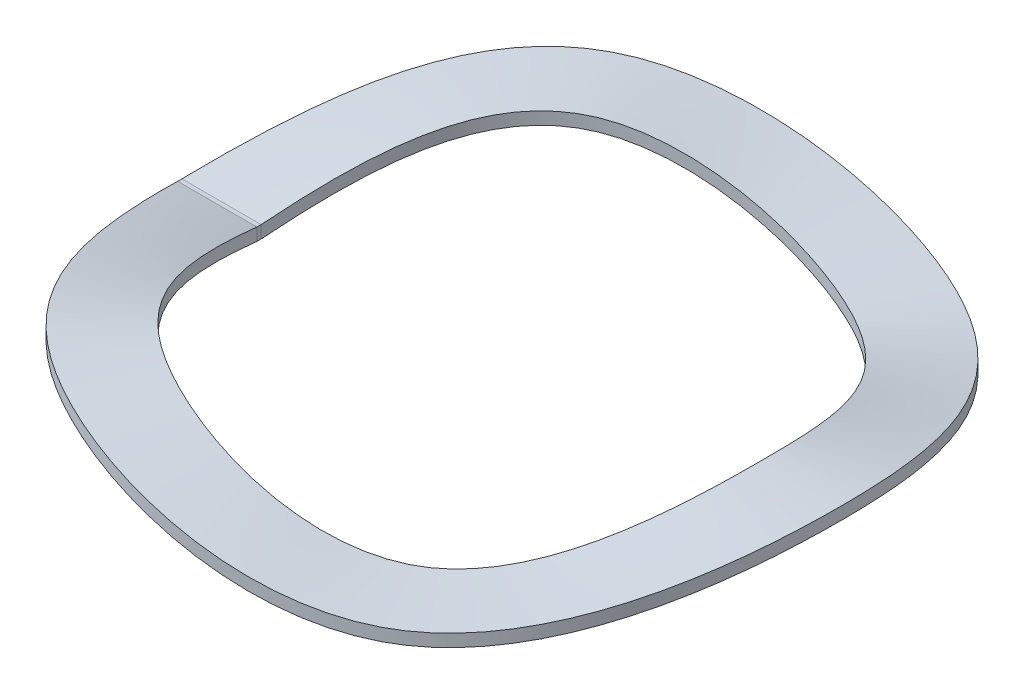
ISO-10303-21;
HEADER;
FILE_DESCRIPTION(('STEP AP214'),'2;1');
FILE_NAME('part.step','',(''),(''),'','','');
FILE_SCHEMA(('AUTOMOTIVE_DESIGN { 1 0 10303 214 1 1 1 1 }'));
ENDSEC;
DATA;
#1=APPLICATION_CONTEXT('core data for automotive mechanical design processes');
#2=APPLICATION_PROTOCOL_DEFINITION('international standard','automotive_design',2000,#1);
#3=PRODUCT_CONTEXT('',#1,'mechanical');
#4=PRODUCT('Part','Part','',(#3));
#5=PRODUCT_RELATED_PRODUCT_CATEGORY('part','',(#4));
#6=PRODUCT_DEFINITION_FORMATION('','',#4);
#7=PRODUCT_DEFINITION_CONTEXT('part definition',#1,'design');
#8=PRODUCT_DEFINITION('design','',#6,#7);
#9=PRODUCT_DEFINITION_SHAPE('','',#8);
#10=(LENGTH_UNIT() NAMED_UNIT(*) SI_UNIT(.MILLI.,.METRE.));
#11=(NAMED_UNIT(*) PLANE_ANGLE_UNIT() SI_UNIT($,.RADIAN.));
#12=(NAMED_UNIT(*) SI_UNIT($,.STERADIAN.) SOLID_ANGLE_UNIT());
#13=UNCERTAINTY_MEASURE_WITH_UNIT(LENGTH_MEASURE(1.E-05),#10,'distance_accuracy_value','');
#14=(GEOMETRIC_REPRESENTATION_CONTEXT(3) GLOBAL_UNCERTAINTY_ASSIGNED_CONTEXT((#13)) GLOBAL_UNIT_ASSIGNED_CONTEXT((#10,
#11,#12)) REPRESENTATION_CONTEXT('',''));
#15=CARTESIAN_POINT('',(0.,0.,0.));
#16=DIRECTION('',(0.,0.,1.));
#17=DIRECTION('',(1.,0.,0.));
#18=AXIS2_PLACEMENT_3D('',#15,#16,#17);
#19=CARTESIAN_POINT('',(-6.,-0.400000000000001,0.));
#20=CARTESIAN_POINT('',(-5.5,0.333333333333333,-2.59807621135331));
#21=CARTESIAN_POINT('',(-3.8333179589676,1.4578130603273,-5.99560515447315));
#22=CARTESIAN_POINT('',(3.66661285638655,-1.40234571114554,-6.29518217855377));
#23=CARTESIAN_POINT('',(7.16686653342131,1.75156978425488,-0.000580667551631552));
#24=CARTESIAN_POINT('',(3.66592100992823,-1.40393342587398,6.29750484876022));
#25=CARTESIAN_POINT('',(-3.80026481582859,1.45257680133357,5.98872832657293));
#26=CARTESIAN_POINT('',(-5.48556759258809,0.333333333333333,2.65624840557529));
#27=CARTESIAN_POINT('',(-6.,-0.400000000000001,0.1));
#28=CARTESIAN_POINT('',(-6.,-0.500000000000001,0.));
#29=CARTESIAN_POINT('',(-5.5,0.233333333333333,-2.59807621135331));
#30=CARTESIAN_POINT('',(-3.8333179589676,1.3578130603273,-5.99560515447315));
#31=CARTESIAN_POINT('',(3.66661285638655,-1.50234571114554,-6.29518217855377));
#32=CARTESIAN_POINT('',(7.16686653342131,1.65156978425488,-0.000580667551631552));
#33=CARTESIAN_POINT('',(3.66592100992823,-1.50393342587398,6.29750484876022));
#34=CARTESIAN_POINT('',(-3.80026481582859,1.35257680133357,5.98872832657293));
#35=CARTESIAN_POINT('',(-5.48556759258809,0.233333333333333,2.65624840557529));
#36=CARTESIAN_POINT('',(-6.,-0.500000000000001,0.1));
#37=CARTESIAN_POINT('',(-6.,-0.600000000000001,0.));
#38=CARTESIAN_POINT('',(-5.5,0.133333333333333,-2.59807621135331));
#39=CARTESIAN_POINT('',(-3.8333179589676,1.2578130603273,-5.99560515447315));
#40=CARTESIAN_POINT('',(3.66661285638655,-1.60234571114554,-6.29518217855377));
#41=CARTESIAN_POINT('',(7.16686653342131,1.55156978425488,-0.000580667551631552));
#42=CARTESIAN_POINT('',(3.66592100992823,-1.60393342587398,6.29750484876022));
#43=CARTESIAN_POINT('',(-3.80026481582859,1.25257680133357,5.98872832657293));
#44=CARTESIAN_POINT('',(-5.48556759258809,0.133333333333333,2.65624840557529));
#45=CARTESIAN_POINT('',(-6.,-0.600000000000001,0.1));
#46=CARTESIAN_POINT('',(-6.,-0.700000000000001,0.));
#47=CARTESIAN_POINT('',(-5.5,0.0333333333333327,-2.59807621135331));
#48=CARTESIAN_POINT('',(-3.8333179589676,1.1578130603273,-5.99560515447315));
#49=CARTESIAN_POINT('',(3.66661285638655,-1.70234571114554,-6.29518217855377));
#50=CARTESIAN_POINT('',(7.16686653342131,1.45156978425488,-0.000580667551631552));
#51=CARTESIAN_POINT('',(3.66592100992823,-1.70393342587398,6.29750484876022));
#52=CARTESIAN_POINT('',(-3.80026481582859,1.15257680133357,5.98872832657293));
#53=CARTESIAN_POINT('',(-5.48556759258809,0.0333333333333328,2.65624840557529));
#54=CARTESIAN_POINT('',(-6.,-0.700000000000001,0.1));
#55=B_SPLINE_SURFACE_WITH_KNOTS('',3,3,((#19,#20,#21,#22,#23,#24,#25,#26,#27),(#28,#29,#30,#31,
#32,#33,#34,#35,#36),(#37,#38,#39,#40,#41,#42,#43,#44,#45),(#46,#47,#48,#49,#50,#51,#52,#53,
#54)),.UNSPECIFIED.,.F.,.F.,.F.,(4,4),(4,1,1,1,1,1,4),(0.,1.),(0.,0.167004014911679,
0.334008029823358,0.501012044735039,0.668016059646718,0.835020074558397,1.),.UNSPECIFIED.);
#56=DIRECTION('',(0.,1.,0.));
#57=VECTOR('',#56,1.);
#58=CARTESIAN_POINT('',(-6.,-0.400000000000001,0.));
#59=LINE('',#58,#57);
#60=CARTESIAN_POINT('',(-6.,-0.700000000000001,0.));
#61=VERTEX_POINT('',#60);
#62=CARTESIAN_POINT('',(-6.,-0.400000000000001,0.));
#63=VERTEX_POINT('',#62);
#64=EDGE_CURVE('E129',#61,#63,#59,.T.);
#65=CARTESIAN_POINT('',(-6.,-0.700000000000001,0.));
#66=CARTESIAN_POINT('',(-5.5,0.0333333333333327,-2.59807621135331));
#67=CARTESIAN_POINT('',(-3.8333179589676,1.1578130603273,-5.99560515447315));
#68=CARTESIAN_POINT('',(3.66661285638655,-1.70234571114554,-6.29518217855377));
#69=CARTESIAN_POINT('',(7.16686653342131,1.45156978425488,-0.000580667551631552));
#70=CARTESIAN_POINT('',(3.66592100992823,-1.70393342587398,6.29750484876022));
#71=CARTESIAN_POINT('',(-3.80026481582859,1.15257680133357,5.98872832657293));
#72=CARTESIAN_POINT('',(-5.48556759258809,0.0333333333333328,2.65624840557529));
#73=CARTESIAN_POINT('',(-6.,-0.700000000000001,0.1));
#74=B_SPLINE_CURVE_WITH_KNOTS('',3,(#65,#66,#67,#68,#69,#70,#71,#72,#73),.UNSPECIFIED.,.F.,.F.,
(4,1,1,1,1,1,4),(0.,0.167004014911679,0.334008029823358,0.501012044735039,0.668016059646718,
0.835020074558397,1.),.UNSPECIFIED.);
#75=CARTESIAN_POINT('',(-6.,-0.700000000000001,0.1));
#76=VERTEX_POINT('',#75);
#77=EDGE_CURVE('E131',#61,#76,#74,.T.);
#78=DIRECTION('',(0.,1.,0.));
#79=VECTOR('',#78,1.);
#80=CARTESIAN_POINT('',(-6.,-0.400000000000001,0.1));
#81=LINE('',#80,#79);
#82=CARTESIAN_POINT('',(-6.,-0.400000000000001,0.1));
#83=VERTEX_POINT('',#82);
#84=EDGE_CURVE('E149',#76,#83,#81,.T.);
#85=CARTESIAN_POINT('',(-6.,-0.400000000000001,0.));
#86=CARTESIAN_POINT('',(-5.5,0.333333333333333,-2.59807621135331));
#87=CARTESIAN_POINT('',(-3.8333179589676,1.4578130603273,-5.99560515447315));
#88=CARTESIAN_POINT('',(3.66661285638655,-1.40234571114554,-6.29518217855377));
#89=CARTESIAN_POINT('',(7.16686653342131,1.75156978425488,-0.000580667551631552));
#90=CARTESIAN_POINT('',(3.66592100992823,-1.40393342587398,6.29750484876022));
#91=CARTESIAN_POINT('',(-3.80026481582859,1.45257680133357,5.98872832657293));
#92=CARTESIAN_POINT('',(-5.48556759258809,0.333333333333333,2.65624840557529));
#93=CARTESIAN_POINT('',(-6.,-0.400000000000001,0.1));
#94=B_SPLINE_CURVE_WITH_KNOTS('',3,(#85,#86,#87,#88,#89,#90,#91,#92,#93),.UNSPECIFIED.,.F.,.F.,
(4,1,1,1,1,1,4),(0.,0.167004014911679,0.334008029823358,0.501012044735039,0.668016059646718,
0.835020074558397,1.),.UNSPECIFIED.);
#95=EDGE_CURVE('E128',#83,#63,#94,.F.);
#96=ORIENTED_EDGE('',*,*,#64,.F.);
#97=ORIENTED_EDGE('',*,*,#77,.T.);
#98=ORIENTED_EDGE('',*,*,#84,.T.);
#99=ORIENTED_EDGE('',*,*,#95,.T.);
#100=EDGE_LOOP('',(#96,#97,#98,#99));
#101=FACE_BOUND('',#100,.T.);
#102=ADVANCED_FACE('F53',(#101),#55,.T.);
#103=CARTESIAN_POINT('',(-6.,-0.700000000000001,0.));
#104=CARTESIAN_POINT('',(-5.5,0.0333333333333326,-2.59807621135331));
#105=CARTESIAN_POINT('',(-3.8333179589676,1.1578130603273,-5.99560515447315));
#106=CARTESIAN_POINT('',(3.66661285638655,-1.70234571114554,-6.29518217855377));
#107=CARTESIAN_POINT('',(7.16686653342131,1.45156978425488,-0.000580667551631901));
#108=CARTESIAN_POINT('',(3.66592100992823,-1.70393342587398,6.29750484876022));
#109=CARTESIAN_POINT('',(-3.80026481582859,1.15257680133357,5.98872832657293));
#110=CARTESIAN_POINT('',(-5.48556759258809,0.0333333333333328,2.65624840557529));
#111=CARTESIAN_POINT('',(-6.,-0.700000000000001,0.1));
#112=CARTESIAN_POINT('',(-6.63333333333333,-0.700000000000001,0.));
#113=CARTESIAN_POINT('',(-6.08055555555556,0.0333333333333324,-2.87231758921838));
#114=CARTESIAN_POINT('',(-4.23794198974714,1.1578130603273,-6.62845859335296));
#115=CARTESIAN_POINT('',(4.05363029744827,-1.70234571114554,-6.95972961005769));
#116=CARTESIAN_POINT('',(7.92342079995396,1.45156978425488,-0.000434037037001991));
#117=CARTESIAN_POINT('',(4.0526865027359,-1.70393342587398,6.96146575820562));
#118=CARTESIAN_POINT('',(-4.20068791012364,1.15257680133357,6.6237519734637));
#119=CARTESIAN_POINT('',(-6.06612295721908,0.0333333333333327,2.93050274793111));
#120=CARTESIAN_POINT('',(-6.63333333333333,-0.700000000000001,0.1));
#121=CARTESIAN_POINT('',(-7.26666666666667,-0.700000000000002,0.));
#122=CARTESIAN_POINT('',(-6.66111111111111,0.0333333333333324,-3.14655896708345));
#123=CARTESIAN_POINT('',(-4.64256602052668,1.1578130603273,-7.26131203223277));
#124=CARTESIAN_POINT('',(4.44064773850999,-1.70234571114554,-7.62427704156161));
#125=CARTESIAN_POINT('',(8.67997506648661,1.45156978425488,-0.00028740652237243));
#126=CARTESIAN_POINT('',(4.43945199554358,-1.70393342587398,7.62542666765102));
#127=CARTESIAN_POINT('',(-4.60111100441868,1.15257680133357,7.25877562035446));
#128=CARTESIAN_POINT('',(-6.64667832185008,0.0333333333333326,3.20475709028693));
#129=CARTESIAN_POINT('',(-7.26666666666667,-0.700000000000002,0.1));
#130=CARTESIAN_POINT('',(-7.9,-0.700000000000002,0.));
#131=CARTESIAN_POINT('',(-7.24166666666667,0.0333333333333322,-3.42080034494852));
#132=CARTESIAN_POINT('',(-5.04719005130622,1.1578130603273,-7.89416547111258));
#133=CARTESIAN_POINT('',(4.82766517957171,-1.70234571114554,-8.28882447306554));
#134=CARTESIAN_POINT('',(9.43652933301926,1.45156978425488,-0.000140776007741125));
#135=CARTESIAN_POINT('',(4.82621748835126,-1.70393342587398,8.28938757709641));
#136=CARTESIAN_POINT('',(-5.00153409871373,1.15257680133357,7.89379926724523));
#137=CARTESIAN_POINT('',(-7.22723368648107,0.0333333333333323,3.47901143264275));
#138=CARTESIAN_POINT('',(-7.9,-0.700000000000002,0.1));
#139=B_SPLINE_SURFACE_WITH_KNOTS('',3,3,((#103,#104,#105,#106,#107,#108,#109,#110,#111),(#112,
#113,#114,#115,#116,#117,#118,#119,#120),(#121,#122,#123,#124,#125,#126,#127,#128,#129),(#130,
#131,#132,#133,#134,#135,#136,#137,#138)),.UNSPECIFIED.,.F.,.F.,.F.,(4,4),(4,1,1,1,1,1,4),(0.,
1.),(0.,0.167004014911679,0.334008029823358,0.501012044735039,0.668016059646718,
0.835020074558397,1.),.UNSPECIFIED.);
#140=DIRECTION('',(1.,0.,0.));
#141=VECTOR('',#140,1.);
#142=CARTESIAN_POINT('',(-7.9,-0.700000000000002,0.));
#143=LINE('',#142,#141);
#144=CARTESIAN_POINT('',(-7.9,-0.700000000000002,0.));
#145=VERTEX_POINT('',#144);
#146=EDGE_CURVE('E81',#145,#61,#143,.T.);
#147=CARTESIAN_POINT('',(-7.9,-0.700000000000002,0.));
#148=CARTESIAN_POINT('',(-7.24166666666667,0.0333333333333322,-3.42080034494852));
#149=CARTESIAN_POINT('',(-5.04719005130622,1.1578130603273,-7.89416547111258));
#150=CARTESIAN_POINT('',(4.82766517957171,-1.70234571114554,-8.28882447306554));
#151=CARTESIAN_POINT('',(9.43652933301926,1.45156978425488,-0.000140776007741125));
#152=CARTESIAN_POINT('',(4.82621748835126,-1.70393342587398,8.28938757709641));
#153=CARTESIAN_POINT('',(-5.00153409871373,1.15257680133357,7.89379926724523));
#154=CARTESIAN_POINT('',(-7.22723368648107,0.0333333333333323,3.47901143264275));
#155=CARTESIAN_POINT('',(-7.9,-0.700000000000002,0.1));
#156=B_SPLINE_CURVE_WITH_KNOTS('',3,(#147,#148,#149,#150,#151,#152,#153,#154,#155),
.UNSPECIFIED.,.F.,.F.,(4,1,1,1,1,1,4),(0.,0.167004014911679,0.334008029823358,0.501012044735039,
0.668016059646718,0.835020074558397,1.),.UNSPECIFIED.);
#157=CARTESIAN_POINT('',(-7.9,-0.700000000000002,0.1));
#158=VERTEX_POINT('',#157);
#159=EDGE_CURVE('E114',#145,#158,#156,.T.);
#160=DIRECTION('',(1.,0.,0.));
#161=VECTOR('',#160,1.);
#162=CARTESIAN_POINT('',(-7.9,-0.700000000000002,0.1));
#163=LINE('',#162,#161);
#164=EDGE_CURVE('E65',#158,#76,#163,.T.);
#165=ORIENTED_EDGE('',*,*,#146,.F.);
#166=ORIENTED_EDGE('',*,*,#159,.T.);
#167=ORIENTED_EDGE('',*,*,#164,.T.);
#168=ORIENTED_EDGE('',*,*,#77,.F.);
#169=EDGE_LOOP('',(#165,#166,#167,#168));
#170=FACE_BOUND('',#169,.T.);
#171=ADVANCED_FACE('F253',(#170),#139,.T.);
#172=CARTESIAN_POINT('',(-7.9,-0.400000000000001,0.));
#173=CARTESIAN_POINT('',(-7.24166666666667,0.333333333333333,-3.42080034494852));
#174=CARTESIAN_POINT('',(-5.04719005130622,1.4578130603273,-7.89416547111258));
#175=CARTESIAN_POINT('',(4.82766517957171,-1.40234571114554,-8.28882447306554));
#176=CARTESIAN_POINT('',(9.43652933301926,1.75156978425488,-0.000140776007741125));
#177=CARTESIAN_POINT('',(4.82621748835126,-1.40393342587398,8.28938757709641));
#178=CARTESIAN_POINT('',(-5.00153409871373,1.45257680133357,7.89379926724523));
#179=CARTESIAN_POINT('',(-7.22723368648107,0.333333333333332,3.47901143264275));
#180=CARTESIAN_POINT('',(-7.9,-0.400000000000001,0.1));
#181=CARTESIAN_POINT('',(-7.26666666666667,-0.400000000000001,0.));
#182=CARTESIAN_POINT('',(-6.66111111111111,0.333333333333333,-3.14655896708345));
#183=CARTESIAN_POINT('',(-4.64256602052668,1.4578130603273,-7.26131203223277));
#184=CARTESIAN_POINT('',(4.44064773850999,-1.40234571114554,-7.62427704156161));
#185=CARTESIAN_POINT('',(8.67997506648661,1.75156978425488,-0.00028740652237243));
#186=CARTESIAN_POINT('',(4.43945199554358,-1.40393342587398,7.62542666765102));
#187=CARTESIAN_POINT('',(-4.60111100441868,1.45257680133357,7.25877562035446));
#188=CARTESIAN_POINT('',(-6.64667832185008,0.333333333333333,3.20475709028693));
#189=CARTESIAN_POINT('',(-7.26666666666667,-0.400000000000001,0.1));
#190=CARTESIAN_POINT('',(-6.63333333333333,-0.400000000000001,0.));
#191=CARTESIAN_POINT('',(-6.08055555555556,0.333333333333333,-2.87231758921838));
#192=CARTESIAN_POINT('',(-4.23794198974714,1.4578130603273,-6.62845859335296));
#193=CARTESIAN_POINT('',(4.05363029744827,-1.40234571114554,-6.95972961005769));
#194=CARTESIAN_POINT('',(7.92342079995396,1.75156978425488,-0.000434037037001991));
#195=CARTESIAN_POINT('',(4.0526865027359,-1.40393342587398,6.96146575820562));
#196=CARTESIAN_POINT('',(-4.20068791012364,1.45257680133357,6.6237519734637));
#197=CARTESIAN_POINT('',(-6.06612295721908,0.333333333333333,2.93050274793111));
#198=CARTESIAN_POINT('',(-6.63333333333333,-0.400000000000001,0.1));
#199=CARTESIAN_POINT('',(-6.,-0.400000000000001,0.));
#200=CARTESIAN_POINT('',(-5.5,0.333333333333333,-2.59807621135331));
#201=CARTESIAN_POINT('',(-3.8333179589676,1.4578130603273,-5.99560515447315));
#202=CARTESIAN_POINT('',(3.66661285638655,-1.40234571114554,-6.29518217855377));
#203=CARTESIAN_POINT('',(7.16686653342131,1.75156978425488,-0.000580667551631901));
#204=CARTESIAN_POINT('',(3.66592100992823,-1.40393342587398,6.29750484876022));
#205=CARTESIAN_POINT('',(-3.80026481582859,1.45257680133357,5.98872832657293));
#206=CARTESIAN_POINT('',(-5.48556759258809,0.333333333333333,2.65624840557529));
#207=CARTESIAN_POINT('',(-6.,-0.400000000000001,0.1));
#208=B_SPLINE_SURFACE_WITH_KNOTS('',3,3,((#172,#173,#174,#175,#176,#177,#178,#179,#180),(#181,
#182,#183,#184,#185,#186,#187,#188,#189),(#190,#191,#192,#193,#194,#195,#196,#197,#198),(#199,
#200,#201,#202,#203,#204,#205,#206,#207)),.UNSPECIFIED.,.F.,.F.,.F.,(4,4),(4,1,1,1,1,1,4),(0.,
1.),(0.,0.167004014911679,0.334008029823358,0.501012044735039,0.668016059646718,
0.835020074558397,1.),.UNSPECIFIED.);
#209=DIRECTION('',(-1.,0.,0.));
#210=VECTOR('',#209,1.);
#211=CARTESIAN_POINT('',(-7.9,-0.400000000000001,0.));
#212=LINE('',#211,#210);
#213=CARTESIAN_POINT('',(-7.9,-0.400000000000001,0.));
#214=VERTEX_POINT('',#213);
#215=EDGE_CURVE('E109',#63,#214,#212,.T.);
#216=DIRECTION('',(-1.,0.,0.));
#217=VECTOR('',#216,1.);
#218=CARTESIAN_POINT('',(-7.9,-0.400000000000001,0.1));
#219=LINE('',#218,#217);
#220=CARTESIAN_POINT('',(-7.9,-0.400000000000001,0.1));
#221=VERTEX_POINT('',#220);
#222=EDGE_CURVE('E111',#83,#221,#219,.T.);
#223=CARTESIAN_POINT('',(-7.9,-0.400000000000001,0.));
#224=CARTESIAN_POINT('',(-7.24166666666667,0.333333333333333,-3.42080034494852));
#225=CARTESIAN_POINT('',(-5.04719005130622,1.4578130603273,-7.89416547111258));
#226=CARTESIAN_POINT('',(4.82766517957171,-1.40234571114554,-8.28882447306554));
#227=CARTESIAN_POINT('',(9.43652933301926,1.75156978425488,-0.000140776007741125));
#228=CARTESIAN_POINT('',(4.82621748835126,-1.40393342587398,8.28938757709641));
#229=CARTESIAN_POINT('',(-5.00153409871373,1.45257680133357,7.89379926724523));
#230=CARTESIAN_POINT('',(-7.22723368648107,0.333333333333332,3.47901143264275));
#231=CARTESIAN_POINT('',(-7.9,-0.400000000000001,0.1));
#232=B_SPLINE_CURVE_WITH_KNOTS('',3,(#223,#224,#225,#226,#227,#228,#229,#230,#231),
.UNSPECIFIED.,.F.,.F.,(4,1,1,1,1,1,4),(0.,0.167004014911679,0.334008029823358,0.501012044735039,
0.668016059646718,0.835020074558397,1.),.UNSPECIFIED.);
#233=EDGE_CURVE('E104',#214,#221,#232,.T.);
#234=ORIENTED_EDGE('',*,*,#215,.F.);
#235=ORIENTED_EDGE('',*,*,#95,.F.);
#236=ORIENTED_EDGE('',*,*,#222,.T.);
#237=ORIENTED_EDGE('',*,*,#233,.F.);
#238=EDGE_LOOP('',(#234,#235,#236,#237));
#239=FACE_BOUND('',#238,.T.);
#240=ADVANCED_FACE('F106',(#239),#208,.T.);
#241=CARTESIAN_POINT('',(-7.9,-0.700000000000002,0.));
#242=CARTESIAN_POINT('',(-7.24166666666667,0.0333333333333322,-3.42080034494852));
#243=CARTESIAN_POINT('',(-5.04719005130622,1.1578130603273,-7.89416547111258));
#244=CARTESIAN_POINT('',(4.82766517957171,-1.70234571114554,-8.28882447306554));
#245=CARTESIAN_POINT('',(9.43652933301926,1.45156978425488,-0.000140776007741125));
#246=CARTESIAN_POINT('',(4.82621748835126,-1.70393342587398,8.28938757709641));
#247=CARTESIAN_POINT('',(-5.00153409871373,1.15257680133357,7.89379926724523));
#248=CARTESIAN_POINT('',(-7.22723368648107,0.0333333333333323,3.47901143264275));
#249=CARTESIAN_POINT('',(-7.9,-0.700000000000002,0.1));
#250=CARTESIAN_POINT('',(-7.9,-0.600000000000002,0.));
#251=CARTESIAN_POINT('',(-7.24166666666667,0.133333333333332,-3.42080034494852));
#252=CARTESIAN_POINT('',(-5.04719005130622,1.2578130603273,-7.89416547111258));
#253=CARTESIAN_POINT('',(4.82766517957171,-1.60234571114554,-8.28882447306554));
#254=CARTESIAN_POINT('',(9.43652933301926,1.55156978425488,-0.000140776007741125));
#255=CARTESIAN_POINT('',(4.82621748835126,-1.60393342587398,8.28938757709641));
#256=CARTESIAN_POINT('',(-5.00153409871373,1.25257680133357,7.89379926724523));
#257=CARTESIAN_POINT('',(-7.22723368648107,0.133333333333332,3.47901143264275));
#258=CARTESIAN_POINT('',(-7.9,-0.600000000000002,0.1));
#259=CARTESIAN_POINT('',(-7.9,-0.500000000000001,0.));
#260=CARTESIAN_POINT('',(-7.24166666666667,0.233333333333333,-3.42080034494852));
#261=CARTESIAN_POINT('',(-5.04719005130622,1.3578130603273,-7.89416547111258));
#262=CARTESIAN_POINT('',(4.82766517957171,-1.50234571114554,-8.28882447306554));
#263=CARTESIAN_POINT('',(9.43652933301926,1.65156978425488,-0.000140776007741125));
#264=CARTESIAN_POINT('',(4.82621748835126,-1.50393342587398,8.28938757709641));
#265=CARTESIAN_POINT('',(-5.00153409871373,1.35257680133357,7.89379926724523));
#266=CARTESIAN_POINT('',(-7.22723368648107,0.233333333333333,3.47901143264275));
#267=CARTESIAN_POINT('',(-7.9,-0.500000000000001,0.1));
#268=CARTESIAN_POINT('',(-7.9,-0.400000000000001,0.));
#269=CARTESIAN_POINT('',(-7.24166666666667,0.333333333333333,-3.42080034494852));
#270=CARTESIAN_POINT('',(-5.04719005130622,1.4578130603273,-7.89416547111258));
#271=CARTESIAN_POINT('',(4.82766517957171,-1.40234571114554,-8.28882447306554));
#272=CARTESIAN_POINT('',(9.43652933301926,1.75156978425488,-0.000140776007741125));
#273=CARTESIAN_POINT('',(4.82621748835126,-1.40393342587398,8.28938757709641));
#274=CARTESIAN_POINT('',(-5.00153409871373,1.45257680133357,7.89379926724523));
#275=CARTESIAN_POINT('',(-7.22723368648107,0.333333333333332,3.47901143264275));
#276=CARTESIAN_POINT('',(-7.9,-0.400000000000001,0.1));
#277=B_SPLINE_SURFACE_WITH_KNOTS('',3,3,((#241,#242,#243,#244,#245,#246,#247,#248,#249),(#250,
#251,#252,#253,#254,#255,#256,#257,#258),(#259,#260,#261,#262,#263,#264,#265,#266,#267),(#268,
#269,#270,#271,#272,#273,#274,#275,#276)),.UNSPECIFIED.,.F.,.F.,.F.,(4,4),(4,1,1,1,1,1,4),(0.,
1.),(0.,0.167004014911679,0.334008029823358,0.501012044735039,0.668016059646718,
0.835020074558397,1.),.UNSPECIFIED.);
#278=DIRECTION('',(0.,-1.,0.));
#279=VECTOR('',#278,1.);
#280=CARTESIAN_POINT('',(-7.9,-0.400000000000001,0.));
#281=LINE('',#280,#279);
#282=EDGE_CURVE('E116',#214,#145,#281,.T.);
#283=DIRECTION('',(0.,-1.,0.));
#284=VECTOR('',#283,1.);
#285=CARTESIAN_POINT('',(-7.9,-0.400000000000001,0.1));
#286=LINE('',#285,#284);
#287=EDGE_CURVE('E12',#221,#158,#286,.T.);
#288=ORIENTED_EDGE('',*,*,#282,.F.);
#289=ORIENTED_EDGE('',*,*,#233,.T.);
#290=ORIENTED_EDGE('',*,*,#287,.T.);
#291=ORIENTED_EDGE('',*,*,#159,.F.);
#292=EDGE_LOOP('',(#288,#289,#290,#291));
#293=FACE_BOUND('',#292,.T.);
#294=ADVANCED_FACE('F55',(#293),#277,.T.);
#295=CARTESIAN_POINT('',(0.,-0.7,0.));
#296=DIRECTION('',(0.,1.,0.));
#297=DIRECTION('',(-1.,0.,0.));
#298=AXIS2_PLACEMENT_3D('',#295,#296,#297);
#299=PLANE('',#298);
#300=DIRECTION('',(0.,0.,1.));
#301=VECTOR('',#300,1.);
#302=CARTESIAN_POINT('',(-6.,-0.700000000000001,0.));
#303=LINE('',#302,#301);
#304=EDGE_CURVE('E144',#61,#76,#303,.T.);
#305=ORIENTED_EDGE('',*,*,#304,.T.);
#306=ORIENTED_EDGE('',*,*,#164,.F.);
#307=DIRECTION('',(0.,0.,1.));
#308=VECTOR('',#307,1.);
#309=CARTESIAN_POINT('',(-7.9,-0.700000000000002,0.));
#310=LINE('',#309,#308);
#311=EDGE_CURVE('E73',#145,#158,#310,.T.);
#312=ORIENTED_EDGE('',*,*,#311,.F.);
#313=ORIENTED_EDGE('',*,*,#146,.T.);
#314=EDGE_LOOP('',(#305,#306,#312,#313));
#315=FACE_BOUND('',#314,.T.);
#316=ADVANCED_FACE('F143',(#315),#299,.F.);
#317=CARTESIAN_POINT('',(-7.9,0.,0.));
#318=DIRECTION('',(1.,0.,0.));
#319=DIRECTION('',(0.,0.,-1.));
#320=AXIS2_PLACEMENT_3D('',#317,#318,#319);
#321=PLANE('',#320);
#322=ORIENTED_EDGE('',*,*,#311,.T.);
#323=ORIENTED_EDGE('',*,*,#287,.F.);
#324=DIRECTION('',(0.,0.,1.));
#325=VECTOR('',#324,1.);
#326=CARTESIAN_POINT('',(-7.9,-0.400000000000001,0.));
#327=LINE('',#326,#325);
#328=EDGE_CURVE('E118',#214,#221,#327,.T.);
#329=ORIENTED_EDGE('',*,*,#328,.F.);
#330=ORIENTED_EDGE('',*,*,#282,.T.);
#331=EDGE_LOOP('',(#322,#323,#329,#330));
#332=FACE_BOUND('',#331,.T.);
#333=ADVANCED_FACE('F120',(#332),#321,.F.);
#334=CARTESIAN_POINT('',(-6.,0.,0.));
#335=DIRECTION('',(-1.,0.,0.));
#336=DIRECTION('',(0.,0.,1.));
#337=AXIS2_PLACEMENT_3D('',#334,#335,#336);
#338=PLANE('',#337);
#339=DIRECTION('',(0.,0.,1.));
#340=VECTOR('',#339,1.);
#341=CARTESIAN_POINT('',(-6.,-0.400000000000001,0.));
#342=LINE('',#341,#340);
#343=EDGE_CURVE('E123',#63,#83,#342,.T.);
#344=ORIENTED_EDGE('',*,*,#343,.T.);
#345=ORIENTED_EDGE('',*,*,#84,.F.);
#346=ORIENTED_EDGE('',*,*,#304,.F.);
#347=ORIENTED_EDGE('',*,*,#64,.T.);
#348=EDGE_LOOP('',(#344,#345,#346,#347));
#349=FACE_BOUND('',#348,.T.);
#350=ADVANCED_FACE('F147',(#349),#338,.F.);
#351=CARTESIAN_POINT('',(0.,-0.4,0.));
#352=DIRECTION('',(0.,-1.,0.));
#353=DIRECTION('',(1.,0.,0.));
#354=AXIS2_PLACEMENT_3D('',#351,#352,#353);
#355=PLANE('',#354);
#356=ORIENTED_EDGE('',*,*,#328,.T.);
#357=ORIENTED_EDGE('',*,*,#222,.F.);
#358=ORIENTED_EDGE('',*,*,#343,.F.);
#359=ORIENTED_EDGE('',*,*,#215,.T.);
#360=EDGE_LOOP('',(#356,#357,#358,#359));
#361=FACE_BOUND('',#360,.T.);
#362=ADVANCED_FACE('F126',(#361),#355,.F.);
#363=CLOSED_SHELL('',(#102,#171,#240,#294,#316,#333,#350,#362));
#364=MANIFOLD_SOLID_BREP('B2',#363);
#365=ADVANCED_BREP_SHAPE_REPRESENTATION('',(#18,#364),#14);
#366=SHAPE_DEFINITION_REPRESENTATION(#9,#365);
ENDSEC;
END-ISO-10303-21;
